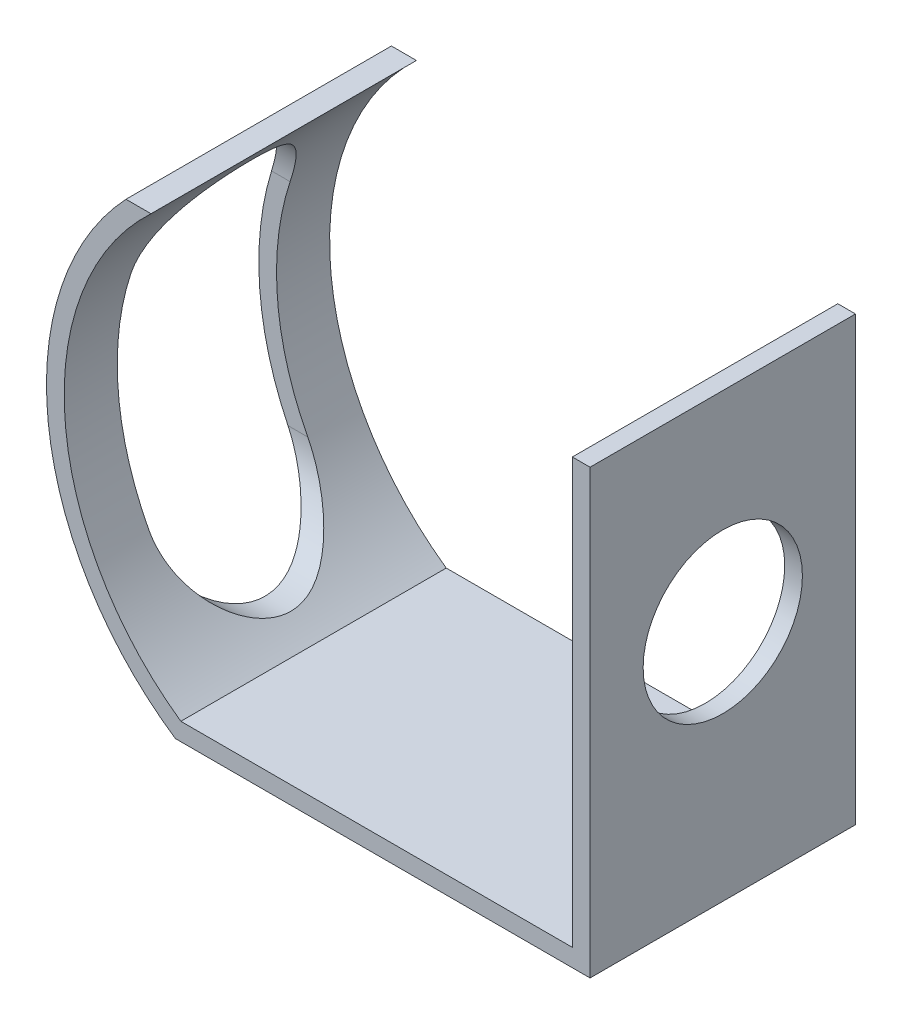
ISO-10303-21;
HEADER;
FILE_DESCRIPTION(('STEP AP214'),'2;1');
FILE_NAME('part.step','',(''),(''),'','','');
FILE_SCHEMA(('AUTOMOTIVE_DESIGN { 1 0 10303 214 1 1 1 1 }'));
ENDSEC;
DATA;
#1=APPLICATION_CONTEXT('core data for automotive mechanical design processes');
#2=APPLICATION_PROTOCOL_DEFINITION('international standard','automotive_design',2000,#1);
#3=PRODUCT_CONTEXT('',#1,'mechanical');
#4=PRODUCT('Part','Part','',(#3));
#5=PRODUCT_RELATED_PRODUCT_CATEGORY('part','',(#4));
#6=PRODUCT_DEFINITION_FORMATION('','',#4);
#7=PRODUCT_DEFINITION_CONTEXT('part definition',#1,'design');
#8=PRODUCT_DEFINITION('design','',#6,#7);
#9=PRODUCT_DEFINITION_SHAPE('','',#8);
#10=(LENGTH_UNIT() NAMED_UNIT(*) SI_UNIT(.MILLI.,.METRE.));
#11=(NAMED_UNIT(*) PLANE_ANGLE_UNIT() SI_UNIT($,.RADIAN.));
#12=(NAMED_UNIT(*) SI_UNIT($,.STERADIAN.) SOLID_ANGLE_UNIT());
#13=UNCERTAINTY_MEASURE_WITH_UNIT(LENGTH_MEASURE(1.E-05),#10,'distance_accuracy_value','');
#14=(GEOMETRIC_REPRESENTATION_CONTEXT(3) GLOBAL_UNCERTAINTY_ASSIGNED_CONTEXT((#13)) GLOBAL_UNIT_ASSIGNED_CONTEXT((#10,
#11,#12)) REPRESENTATION_CONTEXT('',''));
#15=CARTESIAN_POINT('',(0.,0.,0.));
#16=DIRECTION('',(0.,0.,1.));
#17=DIRECTION('',(1.,0.,0.));
#18=AXIS2_PLACEMENT_3D('',#15,#16,#17);
#19=CARTESIAN_POINT('',(-142.186281274897,136.841250999728,75.));
#20=DIRECTION('',(0.,0.,-1.));
#21=DIRECTION('',(-1.,0.,0.));
#22=AXIS2_PLACEMENT_3D('',#19,#20,#21);
#23=CYLINDRICAL_SURFACE('',#22,155.);
#24=CARTESIAN_POINT('',(-142.186281274897,136.841250999728,-75.));
#25=DIRECTION('',(0.,0.,-1.));
#26=DIRECTION('',(1.,0.,0.));
#27=AXIS2_PLACEMENT_3D('',#24,#25,#26);
#28=CIRCLE('',#27,155.);
#29=CARTESIAN_POINT('',(-231.272178277869,9.99999999999998,-75.));
#30=VERTEX_POINT('',#29);
#31=CARTESIAN_POINT('',(-248.111243038843,250.,-75.));
#32=VERTEX_POINT('',#31);
#33=EDGE_CURVE('E210',#30,#32,#28,.T.);
#34=ORIENTED_EDGE('',*,*,#33,.T.);
#35=DIRECTION('',(0.,0.,-1.));
#36=VECTOR('',#35,1.);
#37=CARTESIAN_POINT('',(-248.111243038843,250.,75.));
#38=LINE('',#37,#36);
#39=CARTESIAN_POINT('',(-248.111243038843,250.,75.));
#40=VERTEX_POINT('',#39);
#41=EDGE_CURVE('E216',#40,#32,#38,.T.);
#42=ORIENTED_EDGE('',*,*,#41,.F.);
#43=CARTESIAN_POINT('',(-142.186281274897,136.841250999728,75.));
#44=DIRECTION('',(0.,0.,-1.));
#45=DIRECTION('',(1.,0.,0.));
#46=AXIS2_PLACEMENT_3D('',#43,#44,#45);
#47=CIRCLE('',#46,155.);
#48=CARTESIAN_POINT('',(-231.272178277869,9.99999999999998,75.));
#49=VERTEX_POINT('',#48);
#50=EDGE_CURVE('E215',#49,#40,#47,.T.);
#51=ORIENTED_EDGE('',*,*,#50,.F.);
#52=DIRECTION('',(0.,0.,-1.));
#53=VECTOR('',#52,1.);
#54=CARTESIAN_POINT('',(-231.272178277869,9.99999999999998,75.));
#55=LINE('',#54,#53);
#56=EDGE_CURVE('E41',#49,#30,#55,.T.);
#57=ORIENTED_EDGE('',*,*,#56,.T.);
#58=EDGE_LOOP('',(#34,#42,#51,#57));
#59=FACE_BOUND('',#58,.T.);
#60=CARTESIAN_POINT('',(-289.514944116616,185.,45.0000000001244));
#61=CARTESIAN_POINT('',(-289.293101945858,185.678705591603,45.0000079403308));
#62=CARTESIAN_POINT('',(-289.066555096769,186.355845353168,44.9846455848749));
#63=CARTESIAN_POINT('',(-288.604582409206,187.705668042194,44.9236638699038));
#64=CARTESIAN_POINT('',(-288.369157211543,188.37835128721,44.8780466901642));
#65=CARTESIAN_POINT('',(-287.89005740975,189.717666803059,44.7570719366619));
#66=CARTESIAN_POINT('',(-287.6463873976,190.384302188197,44.6817306764639));
#67=CARTESIAN_POINT('',(-287.151271780437,191.710667952544,44.501853560459));
#68=CARTESIAN_POINT('',(-286.899826043564,192.370398214402,44.397317209322));
#69=CARTESIAN_POINT('',(-286.136491427043,194.332997106331,44.0415522785429));
#70=CARTESIAN_POINT('',(-285.613829947957,195.62422810659,43.7477132440592));
#71=CARTESIAN_POINT('',(-284.545235382897,198.166869874089,43.0508101147846));
#72=CARTESIAN_POINT('',(-283.999299165218,199.418275242823,42.6477312820312));
#73=CARTESIAN_POINT('',(-282.891080916228,201.871760963116,41.7378933388891));
#74=CARTESIAN_POINT('',(-282.328835850982,203.073939927315,41.231355047427));
#75=CARTESIAN_POINT('',(-281.193130001446,205.425514402962,40.1184575909758));
#76=CARTESIAN_POINT('',(-280.619669577728,206.574911607375,39.5121016304837));
#77=CARTESIAN_POINT('',(-279.46722118435,208.817185065787,38.2024887891619));
#78=CARTESIAN_POINT('',(-278.888225745381,209.909966416058,37.499076010746));
#79=CARTESIAN_POINT('',(-277.732840912875,212.031606168385,35.9997201530017));
#80=CARTESIAN_POINT('',(-277.15645161887,213.06046214787,35.2037735702108));
#81=CARTESIAN_POINT('',(-275.979329981358,215.109375621295,33.4713764957052));
#82=CARTESIAN_POINT('',(-275.379251998376,216.125083989223,32.5293221536942));
#83=CARTESIAN_POINT('',(-274.201165538176,218.071572069959,30.5483232605625));
#84=CARTESIAN_POINT('',(-273.623159860494,219.002341030158,29.5093664759851));
#85=CARTESIAN_POINT('',(-272.501349927294,220.770251341426,27.3394273467723));
#86=CARTESIAN_POINT('',(-271.957504744424,221.607505705336,26.2085589982745));
#87=CARTESIAN_POINT('',(-271.176726751848,222.787093252052,24.446579122792));
#88=CARTESIAN_POINT('',(-270.922319240572,223.167544263488,23.8483600475468));
#89=CARTESIAN_POINT('',(-270.426709736856,223.902084427436,22.6303698563795));
#90=CARTESIAN_POINT('',(-270.185511044487,224.256166999978,22.0105934172708));
#91=CARTESIAN_POINT('',(-269.600664546424,225.107663921628,20.4336270134518));
#92=CARTESIAN_POINT('',(-269.266460992354,225.587662911766,19.4634265100158));
#93=CARTESIAN_POINT('',(-268.638293490056,226.48045412955,17.4801001975549));
#94=CARTESIAN_POINT('',(-268.344320409709,226.893261613381,16.4669841987408));
#95=CARTESIAN_POINT('',(-267.9382986133,227.458489170642,14.9190619850179));
#96=CARTESIAN_POINT('',(-267.808807160793,227.63786547088,14.3985047922527));
#97=CARTESIAN_POINT('',(-267.562173467571,227.978124710596,13.3486072246738));
#98=CARTESIAN_POINT('',(-267.445029081439,228.139010863347,12.8192683943123));
#99=CARTESIAN_POINT('',(-267.113173412072,228.593160104738,11.2189743875455));
#100=CARTESIAN_POINT('',(-266.91800759968,228.8579583301,10.1356206123072));
#101=CARTESIAN_POINT('',(-266.584100296524,229.308878076356,7.93670666633617));
#102=CARTESIAN_POINT('',(-266.445731362611,229.494480419031,6.82098367982442));
#103=CARTESIAN_POINT('',(-266.231275023733,229.781402850693,4.57272802712599));
#104=CARTESIAN_POINT('',(-266.155187296559,229.882723375709,3.44019544793384));
#105=CARTESIAN_POINT('',(-266.067684925635,229.999198588639,1.16850329355244));
#106=CARTESIAN_POINT('',(-266.056253505791,230.014375627836,0.0293455141720952));
#107=CARTESIAN_POINT('',(-266.098388511853,229.958333025964,-2.2455805139968));
#108=CARTESIAN_POINT('',(-266.151950363079,229.887119465668,-3.38134899570724));
#109=CARTESIAN_POINT('',(-266.313698885447,229.67120305247,-5.52482875931312));
#110=CARTESIAN_POINT('',(-266.415793919583,229.534686859829,-6.53384405398937));
#111=CARTESIAN_POINT('',(-266.668554385072,229.194964879038,-8.53429791379006));
#112=CARTESIAN_POINT('',(-266.819215964018,228.991764380413,-9.52573786645125));
#113=CARTESIAN_POINT('',(-267.165706964251,228.521283356732,-11.4853657671239));
#114=CARTESIAN_POINT('',(-267.361545021578,228.253990579261,-12.4535492302484));
#115=CARTESIAN_POINT('',(-267.794277502043,227.658466468523,-14.3615533068984));
#116=CARTESIAN_POINT('',(-268.031174359507,227.330231521989,-15.3013722348441));
#117=CARTESIAN_POINT('',(-268.555198428008,226.59708860813,-17.197977641951));
#118=CARTESIAN_POINT('',(-268.844334068501,226.189019521375,-18.1529846964271));
#119=CARTESIAN_POINT('',(-269.457812942651,225.312958732178,-20.0232846447488));
#120=CARTESIAN_POINT('',(-269.782156922521,224.844965759657,-20.9385766962904));
#121=CARTESIAN_POINT('',(-270.460831602313,223.852750182446,-22.726850195733));
#122=CARTESIAN_POINT('',(-270.815170387942,223.328512405578,-23.5998201344692));
#123=CARTESIAN_POINT('',(-271.548673605876,222.227485802224,-25.3010094585916));
#124=CARTESIAN_POINT('',(-271.927839639849,221.650693584378,-26.1292259505177));
#125=CARTESIAN_POINT('',(-272.775368524811,220.340961580121,-27.8821935063602));
#126=CARTESIAN_POINT('',(-273.24761132499,219.59848500041,-28.7979577036086));
#127=CARTESIAN_POINT('',(-274.212638267057,218.050077288329,-30.5625680720482));
#128=CARTESIAN_POINT('',(-274.705424386643,217.244140039956,-31.4114077775968));
#129=CARTESIAN_POINT('',(-275.705347524994,215.572491422828,-33.0406737453068));
#130=CARTESIAN_POINT('',(-276.212496943935,214.706727414631,-33.8210383526163));
#131=CARTESIAN_POINT('',(-277.234644624074,212.920150663312,-35.3103070924538));
#132=CARTESIAN_POINT('',(-277.749643176405,211.99933587457,-36.0192085668671));
#133=CARTESIAN_POINT('',(-278.861744132538,209.960102562928,-37.4671774316871));
#134=CARTESIAN_POINT('',(-279.459230354307,208.833143467472,-38.1939639869738));
#135=CARTESIAN_POINT('',(-280.649330851082,206.516782612009,-39.5452423678248));
#136=CARTESIAN_POINT('',(-281.241944347459,205.327371088494,-40.169718135365));
#137=CARTESIAN_POINT('',(-282.414294327719,202.893706240328,-41.3112566359588));
#138=CARTESIAN_POINT('',(-282.994043172822,201.649509323032,-41.828426855324));
#139=CARTESIAN_POINT('',(-284.13439678303,199.112156165089,-42.7512393585448));
#140=CARTESIAN_POINT('',(-284.695006397227,197.819012503258,-43.1569100782017));
#141=CARTESIAN_POINT('',(-285.629192955804,195.579138443663,-43.7492858428923));
#142=CARTESIAN_POINT('',(-286.009169406793,194.642717410018,-43.9652839556337));
#143=CARTESIAN_POINT('',(-286.754462966622,192.752540453573,-44.3376322137473));
#144=CARTESIAN_POINT('',(-287.119783463457,191.798788612046,-44.4939962165757));
#145=CARTESIAN_POINT('',(-287.834086086068,189.876787342597,-44.7454621309322));
#146=CARTESIAN_POINT('',(-288.183063567975,188.908533895961,-44.8405467266854));
#147=CARTESIAN_POINT('',(-288.692928081494,187.44825355637,-44.9360018706189));
#148=CARTESIAN_POINT('',(-288.860656892482,186.960051585333,-44.9599583817962));
#149=CARTESIAN_POINT('',(-289.191387969822,185.981513822266,-44.9919576233472));
#150=CARTESIAN_POINT('',(-289.354390090597,185.491177965049,-44.9999998640934));
#151=CARTESIAN_POINT('',(-289.514944116616,185.,-45.0000000001244));
#152=B_SPLINE_CURVE_WITH_KNOTS('',3,(#60,#61,#62,#63,#64,#65,#66,#67,#68,#69,#70,#71,#72,#73,
#74,#75,#76,#77,#78,#79,#80,#81,#82,#83,#84,#85,#86,#87,#88,#89,#90,#91,#92,#93,#94,#95,#96,#97,
#98,#99,#100,#101,#102,#103,#104,#105,#106,#107,#108,#109,#110,#111,#112,#113,#114,#115,#116,
#117,#118,#119,#120,#121,#122,#123,#124,#125,#126,#127,#128,#129,#130,#131,#132,#133,#134,#135,
#136,#137,#138,#139,#140,#141,#142,#143,#144,#145,#146,#147,#148,#149,#150,#151),.UNSPECIFIED.,
.F.,.F.,(4,2,2,2,2,2,2,2,2,2,2,2,2,2,2,2,2,2,2,2,2,2,2,2,2,2,2,2,2,2,2,2,2,2,2,2,2,2,2,2,2,2,2,
2,2,4),(0.,2.14189999414514,4.28364568713333,6.42421755037735,8.56482573322492,12.8302478204851,
17.0962456590152,21.3532317577423,25.6100812189308,29.8738496187217,34.1377795034988,
38.6613021702715,43.1853966845168,47.703963260202,49.9628615915063,52.2223217315423,
55.6174955575344,59.0118974128635,60.708305862447,62.4044190578294,65.7962481649792,
69.2099833756892,72.6237009254846,76.0365326920378,79.4491242535953,82.5155769244655,
85.5817864173159,88.6485825404105,91.7155605523232,94.9465188232728,98.1775455852207,
101.409446126625,104.641555371816,108.44781803335,112.2544479723,116.064470957484,
119.874635606544,124.273870217335,128.673794642772,133.069290224604,137.463663777542,
140.562061718812,143.659739231585,146.758291674427,148.308356507514,149.858469030033),.UNSPECIFIED.);
#153=CARTESIAN_POINT('',(-289.514944116616,185.,45.0000000001245));
#154=VERTEX_POINT('',#153);
#155=CARTESIAN_POINT('',(-289.514944116616,185.,-45.0000000001244));
#156=VERTEX_POINT('',#155);
#157=EDGE_CURVE('E133',#154,#156,#152,.T.);
#158=ORIENTED_EDGE('',*,*,#157,.T.);
#159=CARTESIAN_POINT('',(-142.186281274897,136.841250999728,-45.0000000001245));
#160=DIRECTION('',(0.,0.,1.));
#161=DIRECTION('',(0.,-1.,0.));
#162=AXIS2_PLACEMENT_3D('',#159,#160,#161);
#163=CIRCLE('',#162,155.);
#164=CARTESIAN_POINT('',(-279.531957052455,65.,-45.0000000001245));
#165=VERTEX_POINT('',#164);
#166=EDGE_CURVE('E142',#156,#165,#163,.T.);
#167=ORIENTED_EDGE('',*,*,#166,.T.);
#168=CARTESIAN_POINT('',(-279.531957052455,65.,-45.0000000001245));
#169=CARTESIAN_POINT('',(-279.084420199284,64.1443354434482,-45.0000058951737));
#170=CARTESIAN_POINT('',(-278.628870139108,63.2929502400309,-44.9755961967856));
#171=CARTESIAN_POINT('',(-277.703202193171,61.60102720247,-44.8794455861294));
#172=CARTESIAN_POINT('',(-277.233086975691,60.7604874209845,-44.8077132948899));
#173=CARTESIAN_POINT('',(-276.280060684979,59.09306591923,-44.6185111627578));
#174=CARTESIAN_POINT('',(-275.797162896353,58.2661713651923,-44.5010871933924));
#175=CARTESIAN_POINT('',(-274.819523087473,56.6269520951698,-44.2219779095891));
#176=CARTESIAN_POINT('',(-274.324780539247,55.8146280314885,-44.0602906187787));
#177=CARTESIAN_POINT('',(-273.326845190299,54.2092814534464,-43.6947993625822));
#178=CARTESIAN_POINT('',(-272.823692091191,53.4161968448177,-43.4911593584934));
#179=CARTESIAN_POINT('',(-271.808499788501,51.8474067462564,-43.0427108471363));
#180=CARTESIAN_POINT('',(-271.29645937066,51.0717036648372,-42.7978966739599));
#181=CARTESIAN_POINT('',(-270.265040013405,49.5389902026961,-42.2683638827191));
#182=CARTESIAN_POINT('',(-269.745660884895,48.78198030503,-41.983644234713));
#183=CARTESIAN_POINT('',(-268.701112686862,47.2877538717121,-41.3754408203863));
#184=CARTESIAN_POINT('',(-268.175943092955,46.550539149826,-41.0519535166504));
#185=CARTESIAN_POINT('',(-266.741470198109,44.5732200998821,-40.1205355572146));
#186=CARTESIAN_POINT('',(-265.827954252671,43.3533810888701,-39.4755579121501));
#187=CARTESIAN_POINT('',(-263.99729735269,40.9802961578975,-38.0782103145061));
#188=CARTESIAN_POINT('',(-263.08015689273,39.8270414661041,-37.3258545534925));
#189=CARTESIAN_POINT('',(-261.250613322976,37.5901845035564,-35.7155848980335));
#190=CARTESIAN_POINT('',(-260.338215677449,36.5066509480333,-34.8575692226607));
#191=CARTESIAN_POINT('',(-258.529999904841,34.4154291019487,-33.0379341226888));
#192=CARTESIAN_POINT('',(-257.634179899351,33.4077321781825,-32.076326521339));
#193=CARTESIAN_POINT('',(-256.015930024833,31.6318893380191,-30.2149378344355));
#194=CARTESIAN_POINT('',(-255.289065760892,30.8514904850081,-29.3306855287844));
#195=CARTESIAN_POINT('',(-253.865093962242,29.3521283144622,-27.4888988712318));
#196=CARTESIAN_POINT('',(-253.167987072258,28.6331663276824,-26.5313629328191));
#197=CARTESIAN_POINT('',(-251.815538939892,27.2631956061461,-24.5435901327009));
#198=CARTESIAN_POINT('',(-251.160131277917,26.6120776959469,-23.5134746895734));
#199=CARTESIAN_POINT('',(-250.217787546218,25.6909601324073,-21.9129652349022));
#200=CARTESIAN_POINT('',(-249.910498270123,25.3932096922909,-21.3703003419326));
#201=CARTESIAN_POINT('',(-249.311263820872,24.8170983848331,-20.2662828864077));
#202=CARTESIAN_POINT('',(-249.019322236559,24.538742047623,-19.7049260026768));
#203=CARTESIAN_POINT('',(-248.33002870169,23.8863157879552,-18.3161677245952));
#204=CARTESIAN_POINT('',(-247.941892788735,23.5231117942594,-17.4790008652122));
#205=CARTESIAN_POINT('',(-247.208409215771,22.8429927537447,-15.7681273067051));
#206=CARTESIAN_POINT('',(-246.863049567978,22.5260647338958,-14.8944309369744));
#207=CARTESIAN_POINT('',(-246.22244073476,21.942751398693,-13.1130071283865));
#208=CARTESIAN_POINT('',(-245.927158274762,21.6763325077684,-12.2053027801699));
#209=CARTESIAN_POINT('',(-245.393870471974,21.1981706294851,-10.3590008089681));
#210=CARTESIAN_POINT('',(-245.15586556651,20.9864280595924,-9.42040295016583));
#211=CARTESIAN_POINT('',(-244.741943476251,20.6198513968107,-7.50739295400432));
#212=CARTESIAN_POINT('',(-244.566734634198,20.4656657897446,-6.53270120303685));
#213=CARTESIAN_POINT('',(-244.288163555724,20.2211830064201,-4.56509236626437));
#214=CARTESIAN_POINT('',(-244.184799536566,20.1308842448909,-3.57217573331392));
#215=CARTESIAN_POINT('',(-244.05389522474,20.0166093790711,-1.57827071749368));
#216=CARTESIAN_POINT('',(-244.026297270951,19.9925828388038,-0.577289054666627));
#217=CARTESIAN_POINT('',(-244.047875541524,20.0113921703207,1.4231530773599));
#218=CARTESIAN_POINT('',(-244.097043741153,20.0542210533878,2.42261369462959));
#219=CARTESIAN_POINT('',(-244.257145695022,20.1941437935747,4.26065691240635));
#220=CARTESIAN_POINT('',(-244.357704935963,20.2821312763597,5.10087718299459));
#221=CARTESIAN_POINT('',(-244.610062741877,20.5038227911029,6.76731595801823));
#222=CARTESIAN_POINT('',(-244.761853935076,20.6375202458823,7.59353645893015));
#223=CARTESIAN_POINT('',(-245.113019163988,20.9484493388311,9.22785546129337));
#224=CARTESIAN_POINT('',(-245.312418767243,21.1257043705881,10.0359439691908));
#225=CARTESIAN_POINT('',(-245.754348464049,21.5210736572734,11.6300342279669));
#226=CARTESIAN_POINT('',(-245.996885926337,21.7391948932374,12.416032178769));
#227=CARTESIAN_POINT('',(-246.621631480951,22.3052423273215,14.2624015324235));
#228=CARTESIAN_POINT('',(-247.021593783885,22.6707565721029,15.3114201906909));
#229=CARTESIAN_POINT('',(-247.883136237455,23.4678893036809,17.357728638495));
#230=CARTESIAN_POINT('',(-248.344737513764,23.8995304618158,18.3550005292889));
#231=CARTESIAN_POINT('',(-249.319068527764,24.8233185986184,20.2976156740581));
#232=CARTESIAN_POINT('',(-249.83189316856,25.3155782950937,21.2428573116825));
#233=CARTESIAN_POINT('',(-250.897916445062,26.3544428771366,23.0788576473289));
#234=CARTESIAN_POINT('',(-251.451116166792,26.9010492246844,23.9696148786233));
#235=CARTESIAN_POINT('',(-252.812760353803,28.2685033339632,26.0360804079043));
#236=CARTESIAN_POINT('',(-253.63619053293,29.1128052374746,27.1864655216867));
#237=CARTESIAN_POINT('',(-255.325851918468,30.8887066877876,29.3839478405287));
#238=CARTESIAN_POINT('',(-256.192099323832,31.8203393956338,30.431005498013));
#239=CARTESIAN_POINT('',(-257.952998398196,33.7646323866488,32.4236215491398));
#240=CARTESIAN_POINT('',(-258.847679197639,34.7773774981016,33.3690711956713));
#241=CARTESIAN_POINT('',(-260.651950325094,36.8772492545484,35.1569634245204));
#242=CARTESIAN_POINT('',(-261.561538749732,37.9643664592688,35.999419042485));
#243=CARTESIAN_POINT('',(-263.405418082741,40.2332551410492,37.5975544721309));
#244=CARTESIAN_POINT('',(-264.339809860258,41.4165899245654,38.350898662533));
#245=CARTESIAN_POINT('',(-266.203514644565,43.8515921347005,39.7456087097789));
#246=CARTESIAN_POINT('',(-267.132827078035,45.1032671067207,40.3869621688376));
#247=CARTESIAN_POINT('',(-268.975217127566,47.6669708348901,41.5517028608462));
#248=CARTESIAN_POINT('',(-269.888326408812,48.9788583251186,42.0753507589439));
#249=CARTESIAN_POINT('',(-271.691932010089,51.6597151852208,43.0005367488677));
#250=CARTESIAN_POINT('',(-272.582435361152,53.028666447935,43.4021132453226));
#251=CARTESIAN_POINT('',(-273.990787856886,55.2717772918813,43.9445698111309));
#252=CARTESIAN_POINT('',(-274.518294920689,56.1302759386798,44.126003767705));
#253=CARTESIAN_POINT('',(-275.56019634056,57.8639063632932,44.4393043386264));
#254=CARTESIAN_POINT('',(-276.074593943476,58.7390339269914,44.5711833397849));
#255=CARTESIAN_POINT('',(-277.089095666251,60.5047099406272,44.783743522353));
#256=CARTESIAN_POINT('',(-277.58918715118,61.3952709705137,44.8643807045658));
#257=CARTESIAN_POINT('',(-278.573182528624,63.1889388088006,44.9725227184758));
#258=CARTESIAN_POINT('',(-279.057079712684,64.0920506023512,45.0000057924938));
#259=CARTESIAN_POINT('',(-279.531957052455,64.9999999999999,45.0000000001245));
#260=B_SPLINE_CURVE_WITH_KNOTS('',3,(#168,#169,#170,#171,#172,#173,#174,#175,#176,#177,#178,
#179,#180,#181,#182,#183,#184,#185,#186,#187,#188,#189,#190,#191,#192,#193,#194,#195,#196,#197,
#198,#199,#200,#201,#202,#203,#204,#205,#206,#207,#208,#209,#210,#211,#212,#213,#214,#215,#216,
#217,#218,#219,#220,#221,#222,#223,#224,#225,#226,#227,#228,#229,#230,#231,#232,#233,#234,#235,
#236,#237,#238,#239,#240,#241,#242,#243,#244,#245,#246,#247,#248,#249,#250,#251,#252,#253,#254,
#255,#256,#257,#258,#259),.UNSPECIFIED.,.F.,.F.,(4,2,2,2,2,2,2,2,2,2,2,2,2,2,2,2,2,2,2,2,2,2,2,
2,2,2,2,2,2,2,2,2,2,2,2,2,2,2,2,2,2,2,2,2,2,4),(0.,2.89644072113623,5.79235392667661,
8.68536729022324,11.5785098488858,14.4605528098494,17.3429926888778,20.2255069760506,
23.1082844832903,28.0675577971103,33.0261762773849,37.9896092585601,42.9524763475861,
47.1052621714784,51.2581379241292,55.4042241159758,57.4768240919772,59.5499065800659,
62.5223591844945,65.4939768835306,68.4636122417285,71.4332702730788,74.4354436249182,
77.4375424790273,80.4373559771197,83.4368559113626,85.9862977479329,88.5353729012159,
91.085820096982,93.6367033749447,97.1733800870607,100.711272058962,104.255844858195,
107.800513035857,112.735947895205,117.673264476734,122.615813729249,127.557736768988,
132.609131746472,137.661085577881,142.701738884665,147.740804716836,150.811016033012,
153.880459404471,156.952534829282,160.025867487055),.UNSPECIFIED.);
#261=CARTESIAN_POINT('',(-279.531957052455,65.,45.0000000001245));
#262=VERTEX_POINT('',#261);
#263=EDGE_CURVE('E139',#165,#262,#260,.T.);
#264=ORIENTED_EDGE('',*,*,#263,.T.);
#265=CARTESIAN_POINT('',(-142.186281274897,136.841250999728,45.0000000001245));
#266=DIRECTION('',(0.,0.,-1.));
#267=DIRECTION('',(-1.,0.,0.));
#268=AXIS2_PLACEMENT_3D('',#265,#266,#267);
#269=CIRCLE('',#268,155.);
#270=EDGE_CURVE('E124',#262,#154,#269,.T.);
#271=ORIENTED_EDGE('',*,*,#270,.T.);
#272=EDGE_LOOP('',(#158,#167,#264,#271));
#273=FACE_BOUND('',#272,.T.);
#274=ADVANCED_FACE('F33',(#59,#273),#23,.F.);
#275=CARTESIAN_POINT('',(-142.186281274897,136.841250999728,75.));
#276=DIRECTION('',(0.,0.,-1.));
#277=DIRECTION('',(-1.,0.,0.));
#278=AXIS2_PLACEMENT_3D('',#275,#276,#277);
#279=CYLINDRICAL_SURFACE('',#278,165.);
#280=CARTESIAN_POINT('',(-142.186281274897,136.841250999728,-75.));
#281=DIRECTION('',(0.,0.,1.));
#282=DIRECTION('',(1.,0.,0.));
#283=AXIS2_PLACEMENT_3D('',#280,#281,#282);
#284=CIRCLE('',#283,165.);
#285=CARTESIAN_POINT('',(-262.269991763428,250.,-75.));
#286=VERTEX_POINT('',#285);
#287=CARTESIAN_POINT('',(-234.378862455974,0.,-75.));
#288=VERTEX_POINT('',#287);
#289=EDGE_CURVE('E222',#286,#288,#284,.T.);
#290=ORIENTED_EDGE('',*,*,#289,.T.);
#291=DIRECTION('',(0.,0.,-1.));
#292=VECTOR('',#291,1.);
#293=CARTESIAN_POINT('',(-234.378862455974,0.,75.));
#294=LINE('',#293,#292);
#295=CARTESIAN_POINT('',(-234.378862455974,0.,75.));
#296=VERTEX_POINT('',#295);
#297=EDGE_CURVE('E244',#296,#288,#294,.T.);
#298=ORIENTED_EDGE('',*,*,#297,.F.);
#299=CARTESIAN_POINT('',(-142.186281274897,136.841250999728,75.));
#300=DIRECTION('',(0.,0.,1.));
#301=DIRECTION('',(1.,0.,0.));
#302=AXIS2_PLACEMENT_3D('',#299,#300,#301);
#303=CIRCLE('',#302,165.);
#304=CARTESIAN_POINT('',(-262.269991763428,250.,75.));
#305=VERTEX_POINT('',#304);
#306=EDGE_CURVE('E255',#305,#296,#303,.T.);
#307=ORIENTED_EDGE('',*,*,#306,.F.);
#308=DIRECTION('',(0.,0.,-1.));
#309=VECTOR('',#308,1.);
#310=CARTESIAN_POINT('',(-262.269991763428,250.,75.));
#311=LINE('',#310,#309);
#312=EDGE_CURVE('E247',#305,#286,#311,.T.);
#313=ORIENTED_EDGE('',*,*,#312,.T.);
#314=EDGE_LOOP('',(#290,#298,#307,#313));
#315=FACE_BOUND('',#314,.T.);
#316=CARTESIAN_POINT('',(-300.001790318618,185.,-45.0000000001244));
#317=CARTESIAN_POINT('',(-299.796324241225,185.673347660446,-45.000007927535));
#318=CARTESIAN_POINT('',(-299.586534460935,186.345351320393,-44.9848870118551));
#319=CARTESIAN_POINT('',(-299.158791770701,187.685371665605,-44.9248080842916));
#320=CARTESIAN_POINT('',(-298.940839373144,188.353388598086,-44.8798519422864));
#321=CARTESIAN_POINT('',(-298.497336509975,189.683901255965,-44.7605517378466));
#322=CARTESIAN_POINT('',(-298.271789748318,190.346399481797,-44.6862218170985));
#323=CARTESIAN_POINT('',(-297.813549338902,191.664976523334,-44.5086594626723));
#324=CARTESIAN_POINT('',(-297.580855587093,192.321055245396,-44.4054266080302));
#325=CARTESIAN_POINT('',(-296.874301503315,194.274057175568,-44.0538032920683));
#326=CARTESIAN_POINT('',(-296.390531439829,195.560049896967,-43.7630968389056));
#327=CARTESIAN_POINT('',(-295.401673620497,198.093962883325,-43.0728846418141));
#328=CARTESIAN_POINT('',(-294.896583403158,199.341878723352,-42.6733663059491));
#329=CARTESIAN_POINT('',(-293.871399510341,201.79033127099,-41.7706122059955));
#330=CARTESIAN_POINT('',(-293.35133406538,202.990948165381,-41.2675618493393));
#331=CARTESIAN_POINT('',(-292.301233192889,205.340574487218,-40.1615138617931));
#332=CARTESIAN_POINT('',(-291.771198027492,206.489585268854,-39.5585188554866));
#333=CARTESIAN_POINT('',(-290.706733708193,208.73156468732,-38.2556675104417));
#334=CARTESIAN_POINT('',(-290.17229962653,209.824456332464,-37.555682730847));
#335=CARTESIAN_POINT('',(-289.106553167599,211.946802749806,-36.0631785282506));
#336=CARTESIAN_POINT('',(-288.575240890383,212.97625549875,-35.270656156283));
#337=CARTESIAN_POINT('',(-287.496517414676,215.016267045791,-33.5542788610928));
#338=CARTESIAN_POINT('',(-286.949651818911,216.023234506116,-32.6258078468758));
#339=CARTESIAN_POINT('',(-285.876733125416,217.953972165564,-30.6744056316022));
#340=CARTESIAN_POINT('',(-285.350682152365,218.877733883582,-29.6514648227777));
#341=CARTESIAN_POINT('',(-284.585386979946,220.194431600651,-28.0504752469398));
#342=CARTESIAN_POINT('',(-284.334337720711,220.621699458882,-27.5059224122186));
#343=CARTESIAN_POINT('',(-283.841386457655,221.452504977634,-26.3949964566155));
#344=CARTESIAN_POINT('',(-283.599483848345,221.856044209926,-25.8286247851245));
#345=CARTESIAN_POINT('',(-283.126318652567,222.638190083057,-24.6749301115465));
#346=CARTESIAN_POINT('',(-282.895052403772,223.016805325426,-24.0876144464778));
#347=CARTESIAN_POINT('',(-282.444475849208,223.748232429596,-22.8924768537102));
#348=CARTESIAN_POINT('',(-282.225168600872,224.101037700635,-22.2846497457674));
#349=CARTESIAN_POINT('',(-281.679681710693,224.971747542879,-20.6996919797879));
#350=CARTESIAN_POINT('',(-281.363284985494,225.470048025612,-19.7082933208096));
#351=CARTESIAN_POINT('',(-280.769525937638,226.395630574843,-17.6816875236404));
#352=CARTESIAN_POINT('',(-280.492155797221,226.822926867932,-16.6464892135426));
#353=CARTESIAN_POINT('',(-280.109784997833,227.407034407304,-15.0651677176233));
#354=CARTESIAN_POINT('',(-279.987961862693,227.592234638685,-14.5334091484546));
#355=CARTESIAN_POINT('',(-279.756187026654,227.943200900026,-13.4610415032524));
#356=CARTESIAN_POINT('',(-279.646233130718,228.108970523875,-12.9204340850512));
#357=CARTESIAN_POINT('',(-279.438827176356,228.420581153932,-11.8310645863661));
#358=CARTESIAN_POINT('',(-279.341376410264,228.566420100191,-11.2823016694535));
#359=CARTESIAN_POINT('',(-279.159593645943,228.837654388695,-10.1776089269033));
#360=CARTESIAN_POINT('',(-279.075262289168,228.963048731346,-9.62167875227093));
#361=CARTESIAN_POINT('',(-278.841959299901,229.309106563714,-7.93845324206562));
#362=CARTESIAN_POINT('',(-278.713779711583,229.497998930093,-6.80145643589364));
#363=CARTESIAN_POINT('',(-278.516400783035,229.788167714595,-4.51138785460208));
#364=CARTESIAN_POINT('',(-278.447201303929,229.889444339021,-3.35831611733957));
#365=CARTESIAN_POINT('',(-278.369775344078,230.00272772792,-1.04593197805265));
#366=CARTESIAN_POINT('',(-278.361536367159,230.014752787895,0.113379096219922));
#367=CARTESIAN_POINT('',(-278.406261556211,229.949352560753,2.42822450639414));
#368=CARTESIAN_POINT('',(-278.459221922367,229.871932827188,3.58375907230892));
#369=CARTESIAN_POINT('',(-278.617299320956,229.639929553247,5.77771563415046));
#370=CARTESIAN_POINT('',(-278.717296008616,229.492913817687,6.8173219573526));
#371=CARTESIAN_POINT('',(-278.964282970655,229.127906381133,8.87822605299552));
#372=CARTESIAN_POINT('',(-279.111269944908,228.909919664408,9.89952510583734));
#373=CARTESIAN_POINT('',(-279.449013788169,228.405622805073,11.9178084473337));
#374=CARTESIAN_POINT('',(-279.639776985977,228.119302783165,12.9147891971726));
#375=CARTESIAN_POINT('',(-280.06116783753,227.481537804122,14.8790246975191));
#376=CARTESIAN_POINT('',(-280.291797657761,227.13008930761,15.8462778291611));
#377=CARTESIAN_POINT('',(-280.80065347679,226.347028117178,17.792588434849));
#378=CARTESIAN_POINT('',(-281.080642141911,225.912360088185,18.7699537351115));
#379=CARTESIAN_POINT('',(-281.674577143066,224.979330242642,20.682985768469));
#380=CARTESIAN_POINT('',(-281.988524123705,224.480967216987,21.6186517095414));
#381=CARTESIAN_POINT('',(-282.645341069727,223.424387017122,23.4452560417168));
#382=CARTESIAN_POINT('',(-282.988219046713,222.866153251763,24.3361819336836));
#383=CARTESIAN_POINT('',(-283.69785791021,221.693730466579,26.0704023581926));
#384=CARTESIAN_POINT('',(-284.064620269923,221.079537994255,26.9136939466211));
#385=CARTESIAN_POINT('',(-284.8754421347,219.699795498841,28.6768779529882));
#386=CARTESIAN_POINT('',(-285.322691629203,218.925519220999,29.5884873130781));
#387=CARTESIAN_POINT('',(-286.235893078158,217.31216933777,31.3423637763356));
#388=CARTESIAN_POINT('',(-286.701846656981,216.473090098647,32.1846248374327));
#389=CARTESIAN_POINT('',(-287.64650812822,214.734139857575,33.7977591898743));
#390=CARTESIAN_POINT('',(-288.125226111767,213.834219838622,34.5685737051609));
#391=CARTESIAN_POINT('',(-289.089181412973,211.978666475356,36.035404379335));
#392=CARTESIAN_POINT('',(-289.574418920086,211.023031509292,36.7314183592503));
#393=CARTESIAN_POINT('',(-290.609106614671,208.932825044488,38.1313620637405));
#394=CARTESIAN_POINT('',(-291.158711581222,207.79113345389,38.8245795629915));
#395=CARTESIAN_POINT('',(-292.25207329345,205.448316021553,40.1079866510932));
#396=CARTESIAN_POINT('',(-292.795829113645,204.24718093796,40.6981601543982));
#397=CARTESIAN_POINT('',(-293.870103058608,201.793617681178,41.7703843747304));
#398=CARTESIAN_POINT('',(-294.400634418279,200.541244400069,42.2525473941252));
#399=CARTESIAN_POINT('',(-295.442723575357,197.991540465659,43.1048201169623));
#400=CARTESIAN_POINT('',(-295.954287126709,196.694223680973,43.4749640498633));
#401=CARTESIAN_POINT('',(-296.772805727235,194.537158921901,43.9862578542779));
#402=CARTESIAN_POINT('',(-297.087065218185,193.688188178287,44.1618620783597));
#403=CARTESIAN_POINT('',(-297.704139982396,191.977644254809,44.4642158803288));
#404=CARTESIAN_POINT('',(-298.006957976345,191.116074139418,44.5909771394281));
#405=CARTESIAN_POINT('',(-298.599842395086,189.383003036627,44.7945327525485));
#406=CARTESIAN_POINT('',(-298.889912783833,188.511505243983,44.8713427432503));
#407=CARTESIAN_POINT('',(-299.456399012854,186.760783574428,44.9740966020275));
#408=CARTESIAN_POINT('',(-299.732810162513,185.881557163909,45.0000231133108));
#409=CARTESIAN_POINT('',(-300.001790318618,185.,45.0000000001244));
#410=B_SPLINE_CURVE_WITH_KNOTS('',3,(#316,#317,#318,#319,#320,#321,#322,#323,#324,#325,#326,
#327,#328,#329,#330,#331,#332,#333,#334,#335,#336,#337,#338,#339,#340,#341,#342,#343,#344,#345,
#346,#347,#348,#349,#350,#351,#352,#353,#354,#355,#356,#357,#358,#359,#360,#361,#362,#363,#364,
#365,#366,#367,#368,#369,#370,#371,#372,#373,#374,#375,#376,#377,#378,#379,#380,#381,#382,#383,
#384,#385,#386,#387,#388,#389,#390,#391,#392,#393,#394,#395,#396,#397,#398,#399,#400,#401,#402,
#403,#404,#405,#406,#407,#408,#409),.UNSPECIFIED.,.F.,.F.,(4,2,2,2,2,2,2,2,2,2,2,2,2,2,2,2,2,2,
2,2,2,2,2,2,2,2,2,2,2,2,2,2,2,2,2,2,2,2,2,2,2,2,2,2,2,2,4),(0.,2.11178002405801,
4.22342770794739,6.33405999812625,8.44472303073642,12.6524318955792,16.8606278922369,
21.061352329082,25.2619664708139,29.4681975017847,33.6745626125243,38.0937538781675,
42.513395080431,44.7216359055698,46.9297302928494,49.137058604795,51.3449486207007,
54.8027588631569,58.2598754518382,59.9877844818324,61.7153734114913,63.4431407626308,
65.1709925640067,68.6448293010206,72.1186578583971,75.5917743027936,79.0646751159323,
82.2251687850547,85.385440541582,88.5461694719443,91.7070702210184,95.0208679668693,
98.334728626991,101.649509995871,104.964496016399,108.791436588141,112.618710235542,
116.449104982221,120.279611279747,124.607610254591,128.93628424308,133.260436446239,
137.58326598922,140.348400290748,143.112872875741,145.876479656698,148.641028963948),.UNSPECIFIED.);
#411=CARTESIAN_POINT('',(-300.001790318618,185.,-45.0000000001244));
#412=VERTEX_POINT('',#411);
#413=CARTESIAN_POINT('',(-300.001790318618,185.,45.0000000001245));
#414=VERTEX_POINT('',#413);
#415=EDGE_CURVE('E130',#412,#414,#410,.T.);
#416=ORIENTED_EDGE('',*,*,#415,.T.);
#417=CARTESIAN_POINT('',(-142.186281274897,136.841250999728,45.0000000001245));
#418=DIRECTION('',(0.,0.,-1.));
#419=DIRECTION('',(-1.,0.,0.));
#420=AXIS2_PLACEMENT_3D('',#417,#418,#419);
#421=CIRCLE('',#420,165.);
#422=CARTESIAN_POINT('',(-290.725281725264,65.,45.0000000001245));
#423=VERTEX_POINT('',#422);
#424=EDGE_CURVE('E119',#414,#423,#421,.F.);
#425=ORIENTED_EDGE('',*,*,#424,.T.);
#426=CARTESIAN_POINT('',(-290.725281725264,65.,45.0000000001245));
#427=CARTESIAN_POINT('',(-290.374888070719,64.2754923129435,45.0000039819248));
#428=CARTESIAN_POINT('',(-290.01918576738,63.5535981774404,44.9825033859898));
#429=CARTESIAN_POINT('',(-289.297977820586,62.1164640789348,44.9132787131404));
#430=CARTESIAN_POINT('',(-288.932473180408,61.4012234449571,44.8615581259422));
#431=CARTESIAN_POINT('',(-288.192651267016,59.9791528229749,44.7247247916245));
#432=CARTESIAN_POINT('',(-287.818340077365,59.2723175088767,44.6396344945055));
#433=CARTESIAN_POINT('',(-287.061514411444,57.8678153687393,44.436870924413));
#434=CARTESIAN_POINT('',(-286.678999723426,57.1701487801147,44.3191968094504));
#435=CARTESIAN_POINT('',(-285.522362960992,55.0961173006436,43.919152879015));
#436=CARTESIAN_POINT('',(-284.737100935919,53.7347907032443,43.5893755090156));
#437=CARTESIAN_POINT('',(-283.144160087322,51.0607138969013,42.809313209727));
#438=CARTESIAN_POINT('',(-282.33647737862,49.7479722001351,42.3590072762816));
#439=CARTESIAN_POINT('',(-280.708325025431,47.1810779119375,41.3447100181663));
#440=CARTESIAN_POINT('',(-279.887896867148,45.9267734905186,40.7810361760114));
#441=CARTESIAN_POINT('',(-278.239917970127,43.4785952421442,39.5437788708234));
#442=CARTESIAN_POINT('',(-277.412367318556,42.2847206768592,38.8701967510697));
#443=CARTESIAN_POINT('',(-275.757610718158,39.9612397992025,37.4157895907094));
#444=CARTESIAN_POINT('',(-274.930406343023,38.8317114128338,36.6348382687951));
#445=CARTESIAN_POINT('',(-273.286821549604,36.6438467873621,34.9688295598306));
#446=CARTESIAN_POINT('',(-272.470440195648,35.5855043614339,34.0837812383532));
#447=CARTESIAN_POINT('',(-270.940691213776,33.6488698894491,32.3056626935237));
#448=CARTESIAN_POINT('',(-270.225244595592,32.7631875390265,31.4224234819509));
#449=CARTESIAN_POINT('',(-268.820936151404,31.0590080792156,29.5734633241952));
#450=CARTESIAN_POINT('',(-268.132075323131,30.2405134899995,28.6077392868264));
#451=CARTESIAN_POINT('',(-266.792718847813,28.6779802781421,26.5956978779428));
#452=CARTESIAN_POINT('',(-266.14216897105,27.9338353190334,25.5494995084976));
#453=CARTESIAN_POINT('',(-264.89110420963,26.5261910274675,23.3760805194891));
#454=CARTESIAN_POINT('',(-264.290573588063,25.862666300143,22.2488855923034));
#455=CARTESIAN_POINT('',(-263.302524259727,24.7866125334627,20.2197091747316));
#456=CARTESIAN_POINT('',(-262.900289157572,24.3537460372629,19.3356275841708));
#457=CARTESIAN_POINT('',(-262.1379771213,23.541203053225,17.5257426467121));
#458=CARTESIAN_POINT('',(-261.777894756056,23.1615197118141,16.5999446960518));
#459=CARTESIAN_POINT('',(-261.107310667041,22.460202692797,14.7098983311025));
#460=CARTESIAN_POINT('',(-260.796776299896,22.1385307775604,13.7456757596109));
#461=CARTESIAN_POINT('',(-260.232351273175,21.5577319999908,11.7820531143845));
#462=CARTESIAN_POINT('',(-259.978461293179,21.2986058880379,10.7826526187748));
#463=CARTESIAN_POINT('',(-259.644327239309,20.9592731997237,9.25689195626484));
#464=CARTESIAN_POINT('',(-259.540317367409,20.8539733860351,8.74111887909866));
#465=CARTESIAN_POINT('',(-259.349358526976,20.6610813937287,7.70316491374279));
#466=CARTESIAN_POINT('',(-259.262407391398,20.5734869658763,7.18098484842707));
#467=CARTESIAN_POINT('',(-259.106274734314,20.4164796487924,6.13118840799066));
#468=CARTESIAN_POINT('',(-259.037095659449,20.3470692628915,5.60357129475189));
#469=CARTESIAN_POINT('',(-258.917127227285,20.226857273879,4.54420604831508));
#470=CARTESIAN_POINT('',(-258.86633540663,20.1760531780563,4.01245847823508));
#471=CARTESIAN_POINT('',(-258.783614375527,20.093380194052,2.94637855178283));
#472=CARTESIAN_POINT('',(-258.751672875902,20.0614989693167,2.412048108893));
#473=CARTESIAN_POINT('',(-258.706897573108,20.0168230127095,1.34185951898047));
#474=CARTESIAN_POINT('',(-258.69406131158,20.0040258252056,0.806001577400078));
#475=CARTESIAN_POINT('',(-258.687611739183,19.9975945781175,-0.265936747285353));
#476=CARTESIAN_POINT('',(-258.693997790768,20.0039598829715,-0.802017122423307));
#477=CARTESIAN_POINT('',(-258.725920811028,20.0358023679892,-1.87298272261908));
#478=CARTESIAN_POINT('',(-258.751457097953,20.0612788677931,-2.40786798954296));
#479=CARTESIAN_POINT('',(-258.846254855098,20.1559550578446,-3.85292671064209));
#480=CARTESIAN_POINT('',(-258.93367025838,20.2433372058005,-4.76084049386733));
#481=CARTESIAN_POINT('',(-259.161462264881,20.4718703398429,-6.56284425544222));
#482=CARTESIAN_POINT('',(-259.301831482572,20.6130138278022,-7.45693614345303));
#483=CARTESIAN_POINT('',(-259.632173872586,20.9468276040526,-9.22653929133716));
#484=CARTESIAN_POINT('',(-259.822170291382,21.1395220409712,-10.1020416350901));
#485=CARTESIAN_POINT('',(-260.247528945101,21.5735885714934,-11.8296464265002));
#486=CARTESIAN_POINT('',(-260.482898530497,21.8149685524722,-12.6817450571568));
#487=CARTESIAN_POINT('',(-261.072499174655,22.4240431146112,-14.6152279502887));
#488=CARTESIAN_POINT('',(-261.441081759879,22.8078042207481,-15.6872078260388));
#489=CARTESIAN_POINT('',(-262.237200789656,23.6462392280118,-17.7802860222585));
#490=CARTESIAN_POINT('',(-262.664752795152,24.1009318508211,-18.8013708153115));
#491=CARTESIAN_POINT('',(-263.569465938408,25.0755807639102,-20.7911018271236));
#492=CARTESIAN_POINT('',(-264.046704622121,25.595639341037,-21.7596623775649));
#493=CARTESIAN_POINT('',(-265.041081394554,26.6947683920826,-23.6409903687708));
#494=CARTESIAN_POINT('',(-265.55822132888,27.2738415960803,-24.5537552252399));
#495=CARTESIAN_POINT('',(-266.794125188666,28.6792593473669,-26.604561242476));
#496=CARTESIAN_POINT('',(-267.524669437661,29.5256391355485,-27.7218238815412));
#497=CARTESIAN_POINT('',(-269.025374889501,31.3035854986271,-29.8577196718394));
#498=CARTESIAN_POINT('',(-269.795548190964,32.2351781570494,-30.8763224256718));
#499=CARTESIAN_POINT('',(-271.362962584941,34.1770249694242,-32.8150591736873));
#500=CARTESIAN_POINT('',(-272.160228183005,35.1873514687137,-33.7351007163087));
#501=CARTESIAN_POINT('',(-273.769878755285,37.2797162979369,-35.4744485433559));
#502=CARTESIAN_POINT('',(-274.582262193887,38.3617473726733,-36.2937649954482));
#503=CARTESIAN_POINT('',(-276.225442154767,40.6099031376315,-37.8419753769813));
#504=CARTESIAN_POINT('',(-277.056327117452,41.777084195873,-38.5692412012175));
#505=CARTESIAN_POINT('',(-278.714945635842,44.1749192161306,-39.9149864921297));
#506=CARTESIAN_POINT('',(-279.542678880279,45.405579281356,-40.5334554731921));
#507=CARTESIAN_POINT('',(-281.185138891902,47.9223471778945,-41.6563190068709));
#508=CARTESIAN_POINT('',(-281.999887677853,49.2083434140832,-42.1609314135553));
#509=CARTESIAN_POINT('',(-283.610314416363,51.8317822565031,-43.0524811424959));
#510=CARTESIAN_POINT('',(-284.405997877975,53.1692097031278,-43.4394528449555));
#511=CARTESIAN_POINT('',(-285.674201488154,55.3724474146218,-43.9666136889407));
#512=CARTESIAN_POINT('',(-286.154814992469,56.2247115448885,-44.144732968236));
#513=CARTESIAN_POINT('',(-287.104302018572,57.9442842812528,-44.4519899226001));
#514=CARTESIAN_POINT('',(-287.573178349098,58.8115892023046,-44.5811394229784));
#515=CARTESIAN_POINT('',(-288.497906246588,60.5596292311712,-44.789040181652));
#516=CARTESIAN_POINT('',(-288.953751652487,61.4403703994602,-44.8677679649523));
#517=CARTESIAN_POINT('',(-289.850869747023,63.2127293871595,-44.9732619627179));
#518=CARTESIAN_POINT('',(-290.292136872144,64.1043511851831,-45.0000085596988));
#519=CARTESIAN_POINT('',(-290.725281725264,64.9999999999999,-45.0000000001245));
#520=B_SPLINE_CURVE_WITH_KNOTS('',3,(#426,#427,#428,#429,#430,#431,#432,#433,#434,#435,#436,
#437,#438,#439,#440,#441,#442,#443,#444,#445,#446,#447,#448,#449,#450,#451,#452,#453,#454,#455,
#456,#457,#458,#459,#460,#461,#462,#463,#464,#465,#466,#467,#468,#469,#470,#471,#472,#473,#474,
#475,#476,#477,#478,#479,#480,#481,#482,#483,#484,#485,#486,#487,#488,#489,#490,#491,#492,#493,
#494,#495,#496,#497,#498,#499,#500,#501,#502,#503,#504,#505,#506,#507,#508,#509,#510,#511,#512,
#513,#514,#515,#516,#517,#518,#519),.UNSPECIFIED.,.F.,.F.,(4,2,2,2,2,2,2,2,2,2,2,2,2,2,2,2,2,2,
2,2,2,2,2,2,2,2,2,2,2,2,2,2,2,2,2,2,2,2,2,2,2,2,2,2,2,2,4),(0.,2.41409451762924,
4.82794288656305,7.24017007905652,9.65245961105712,14.4637383985918,19.2758561799582,
24.0746808937817,28.8734469616128,33.6779061221397,38.4819471825338,42.8009750253818,
47.1201647983901,51.4330859817791,55.744645080553,58.9321353557038,62.1192144887555,
65.3041851518442,68.4891940240482,70.0984631303617,71.7075276717042,73.316813610813,
74.9258838726573,76.5339039636537,78.1417171253483,79.7494769613373,81.3571795636825,
84.1024829962788,86.8474036798338,89.5936124577789,92.3402664973095,95.9253116853095,
99.5113047170374,103.102980773705,106.694823060592,111.430022423127,116.166676104384,
120.907734619928,125.648314156971,130.463586728897,135.279323132827,140.085765417472,
144.890801677953,147.873138449868,150.854754582429,153.837757868081,156.821886708385),.UNSPECIFIED.);
#521=CARTESIAN_POINT('',(-290.725281725264,64.9999999999999,-45.0000000001245));
#522=VERTEX_POINT('',#521);
#523=EDGE_CURVE('E144',#423,#522,#520,.T.);
#524=ORIENTED_EDGE('',*,*,#523,.T.);
#525=CARTESIAN_POINT('',(-142.186281274897,136.841250999728,-45.0000000001245));
#526=DIRECTION('',(0.,0.,1.));
#527=DIRECTION('',(0.,-1.,0.));
#528=AXIS2_PLACEMENT_3D('',#525,#526,#527);
#529=CIRCLE('',#528,165.);
#530=EDGE_CURVE('E138',#522,#412,#529,.F.);
#531=ORIENTED_EDGE('',*,*,#530,.T.);
#532=EDGE_LOOP('',(#416,#425,#524,#531));
#533=FACE_BOUND('',#532,.T.);
#534=ADVANCED_FACE('F137',(#315,#533),#279,.T.);
#535=CARTESIAN_POINT('',(-10.,250.,75.));
#536=DIRECTION('',(1.,0.,0.));
#537=DIRECTION('',(0.,1.,0.));
#538=AXIS2_PLACEMENT_3D('',#535,#536,#537);
#539=PLANE('',#538);
#540=CARTESIAN_POINT('',(-9.99999999999995,136.841249694493,1.29021105129916E-10));
#541=DIRECTION('',(1.,0.,0.));
#542=DIRECTION('',(0.,1.,0.));
#543=AXIS2_PLACEMENT_3D('',#540,#541,#542);
#544=CIRCLE('',#543,45.0000000001245);
#545=CARTESIAN_POINT('',(-9.99999999999996,181.841249694617,1.29021105129916E-10));
#546=VERTEX_POINT('',#545);
#547=EDGE_CURVE('E266',#546,#546,#544,.F.);
#548=ORIENTED_EDGE('',*,*,#547,.F.);
#549=EDGE_LOOP('',(#548));
#550=FACE_BOUND('',#549,.T.);
#551=DIRECTION('',(0.,-1.,0.));
#552=VECTOR('',#551,1.);
#553=CARTESIAN_POINT('',(-10.,250.,-75.));
#554=LINE('',#553,#552);
#555=CARTESIAN_POINT('',(-10.,250.,-75.));
#556=VERTEX_POINT('',#555);
#557=CARTESIAN_POINT('',(-9.99999999999994,10.,-75.));
#558=VERTEX_POINT('',#557);
#559=EDGE_CURVE('E211',#556,#558,#554,.T.);
#560=ORIENTED_EDGE('',*,*,#559,.T.);
#561=DIRECTION('',(0.,0.,-1.));
#562=VECTOR('',#561,1.);
#563=CARTESIAN_POINT('',(-9.99999999999994,10.,75.));
#564=LINE('',#563,#562);
#565=CARTESIAN_POINT('',(-9.99999999999994,10.,75.));
#566=VERTEX_POINT('',#565);
#567=EDGE_CURVE('E11',#566,#558,#564,.T.);
#568=ORIENTED_EDGE('',*,*,#567,.F.);
#569=DIRECTION('',(0.,-1.,0.));
#570=VECTOR('',#569,1.);
#571=CARTESIAN_POINT('',(-10.,250.,75.));
#572=LINE('',#571,#570);
#573=CARTESIAN_POINT('',(-10.,250.,75.));
#574=VERTEX_POINT('',#573);
#575=EDGE_CURVE('E233',#574,#566,#572,.T.);
#576=ORIENTED_EDGE('',*,*,#575,.F.);
#577=DIRECTION('',(0.,0.,-1.));
#578=VECTOR('',#577,1.);
#579=CARTESIAN_POINT('',(-10.,250.,75.));
#580=LINE('',#579,#578);
#581=EDGE_CURVE('E234',#574,#556,#580,.T.);
#582=ORIENTED_EDGE('',*,*,#581,.T.);
#583=EDGE_LOOP('',(#560,#568,#576,#582));
#584=FACE_BOUND('',#583,.T.);
#585=ADVANCED_FACE('F35',(#550,#584),#539,.F.);
#586=CARTESIAN_POINT('',(-9.99999999999994,10.,75.));
#587=DIRECTION('',(0.,-1.,0.));
#588=DIRECTION('',(1.,0.,0.));
#589=AXIS2_PLACEMENT_3D('',#586,#587,#588);
#590=PLANE('',#589);
#591=DIRECTION('',(-1.,0.,0.));
#592=VECTOR('',#591,1.);
#593=CARTESIAN_POINT('',(-9.99999999999994,10.,-75.));
#594=LINE('',#593,#592);
#595=EDGE_CURVE('E202',#558,#30,#594,.T.);
#596=ORIENTED_EDGE('',*,*,#595,.T.);
#597=ORIENTED_EDGE('',*,*,#56,.F.);
#598=DIRECTION('',(-1.,0.,0.));
#599=VECTOR('',#598,1.);
#600=CARTESIAN_POINT('',(-9.99999999999994,10.,75.));
#601=LINE('',#600,#599);
#602=EDGE_CURVE('E259',#566,#49,#601,.T.);
#603=ORIENTED_EDGE('',*,*,#602,.F.);
#604=ORIENTED_EDGE('',*,*,#567,.T.);
#605=EDGE_LOOP('',(#596,#597,#603,#604));
#606=FACE_BOUND('',#605,.T.);
#607=ADVANCED_FACE('F191',(#606),#590,.F.);
#608=CARTESIAN_POINT('',(-262.269991763428,250.,75.));
#609=DIRECTION('',(0.,-1.,0.));
#610=DIRECTION('',(0.,0.,-1.));
#611=AXIS2_PLACEMENT_3D('',#608,#609,#610);
#612=PLANE('',#611);
#613=DIRECTION('',(-1.,0.,0.));
#614=VECTOR('',#613,1.);
#615=CARTESIAN_POINT('',(-262.269991763428,250.,-75.));
#616=LINE('',#615,#614);
#617=EDGE_CURVE('E220',#32,#286,#616,.T.);
#618=ORIENTED_EDGE('',*,*,#617,.T.);
#619=ORIENTED_EDGE('',*,*,#312,.F.);
#620=DIRECTION('',(-1.,0.,0.));
#621=VECTOR('',#620,1.);
#622=CARTESIAN_POINT('',(-262.269991763428,250.,75.));
#623=LINE('',#622,#621);
#624=EDGE_CURVE('E252',#40,#305,#623,.T.);
#625=ORIENTED_EDGE('',*,*,#624,.F.);
#626=ORIENTED_EDGE('',*,*,#41,.T.);
#627=EDGE_LOOP('',(#618,#619,#625,#626));
#628=FACE_BOUND('',#627,.T.);
#629=ADVANCED_FACE('F190',(#628),#612,.F.);
#630=CARTESIAN_POINT('',(0.,0.,75.));
#631=DIRECTION('',(0.,1.,0.));
#632=DIRECTION('',(-1.,0.,0.));
#633=AXIS2_PLACEMENT_3D('',#630,#631,#632);
#634=PLANE('',#633);
#635=DIRECTION('',(1.,0.,0.));
#636=VECTOR('',#635,1.);
#637=CARTESIAN_POINT('',(0.,0.,-75.));
#638=LINE('',#637,#636);
#639=CARTESIAN_POINT('',(0.,0.,-75.));
#640=VERTEX_POINT('',#639);
#641=EDGE_CURVE('E227',#288,#640,#638,.T.);
#642=ORIENTED_EDGE('',*,*,#641,.T.);
#643=DIRECTION('',(0.,0.,-1.));
#644=VECTOR('',#643,1.);
#645=CARTESIAN_POINT('',(0.,0.,75.));
#646=LINE('',#645,#644);
#647=CARTESIAN_POINT('',(0.,0.,75.));
#648=VERTEX_POINT('',#647);
#649=EDGE_CURVE('E241',#648,#640,#646,.T.);
#650=ORIENTED_EDGE('',*,*,#649,.F.);
#651=DIRECTION('',(1.,0.,0.));
#652=VECTOR('',#651,1.);
#653=CARTESIAN_POINT('',(0.,0.,75.));
#654=LINE('',#653,#652);
#655=EDGE_CURVE('E257',#296,#648,#654,.T.);
#656=ORIENTED_EDGE('',*,*,#655,.F.);
#657=ORIENTED_EDGE('',*,*,#297,.T.);
#658=EDGE_LOOP('',(#642,#650,#656,#657));
#659=FACE_BOUND('',#658,.T.);
#660=ADVANCED_FACE('F198',(#659),#634,.F.);
#661=CARTESIAN_POINT('',(0.,250.,75.));
#662=DIRECTION('',(-1.,0.,0.));
#663=DIRECTION('',(0.,-1.,0.));
#664=AXIS2_PLACEMENT_3D('',#661,#662,#663);
#665=PLANE('',#664);
#666=CARTESIAN_POINT('',(0.,136.841249694493,1.29021105129916E-10));
#667=DIRECTION('',(1.,0.,0.));
#668=DIRECTION('',(0.,1.,0.));
#669=AXIS2_PLACEMENT_3D('',#666,#667,#668);
#670=CIRCLE('',#669,45.0000000001245);
#671=CARTESIAN_POINT('',(0.,181.841249694617,1.29021105129916E-10));
#672=VERTEX_POINT('',#671);
#673=EDGE_CURVE('E269',#672,#672,#670,.T.);
#674=ORIENTED_EDGE('',*,*,#673,.F.);
#675=EDGE_LOOP('',(#674));
#676=FACE_BOUND('',#675,.T.);
#677=DIRECTION('',(0.,1.,0.));
#678=VECTOR('',#677,1.);
#679=CARTESIAN_POINT('',(0.,250.,-75.));
#680=LINE('',#679,#678);
#681=CARTESIAN_POINT('',(0.,250.,-75.));
#682=VERTEX_POINT('',#681);
#683=EDGE_CURVE('E229',#640,#682,#680,.T.);
#684=ORIENTED_EDGE('',*,*,#683,.T.);
#685=DIRECTION('',(0.,0.,-1.));
#686=VECTOR('',#685,1.);
#687=CARTESIAN_POINT('',(0.,250.,75.));
#688=LINE('',#687,#686);
#689=CARTESIAN_POINT('',(0.,250.,75.));
#690=VERTEX_POINT('',#689);
#691=EDGE_CURVE('E237',#690,#682,#688,.T.);
#692=ORIENTED_EDGE('',*,*,#691,.F.);
#693=DIRECTION('',(0.,1.,0.));
#694=VECTOR('',#693,1.);
#695=CARTESIAN_POINT('',(0.,250.,75.));
#696=LINE('',#695,#694);
#697=EDGE_CURVE('E264',#648,#690,#696,.T.);
#698=ORIENTED_EDGE('',*,*,#697,.F.);
#699=ORIENTED_EDGE('',*,*,#649,.T.);
#700=EDGE_LOOP('',(#684,#692,#698,#699));
#701=FACE_BOUND('',#700,.T.);
#702=ADVANCED_FACE('F290',(#676,#701),#665,.F.);
#703=CARTESIAN_POINT('',(-10.,250.,75.));
#704=DIRECTION('',(0.,-1.,0.));
#705=DIRECTION('',(0.,0.,-1.));
#706=AXIS2_PLACEMENT_3D('',#703,#704,#705);
#707=PLANE('',#706);
#708=DIRECTION('',(-1.,0.,0.));
#709=VECTOR('',#708,1.);
#710=CARTESIAN_POINT('',(-10.,250.,-75.));
#711=LINE('',#710,#709);
#712=EDGE_CURVE('E231',#682,#556,#711,.T.);
#713=ORIENTED_EDGE('',*,*,#712,.T.);
#714=ORIENTED_EDGE('',*,*,#581,.F.);
#715=DIRECTION('',(-1.,0.,0.));
#716=VECTOR('',#715,1.);
#717=CARTESIAN_POINT('',(-10.,250.,75.));
#718=LINE('',#717,#716);
#719=EDGE_CURVE('E238',#690,#574,#718,.T.);
#720=ORIENTED_EDGE('',*,*,#719,.F.);
#721=ORIENTED_EDGE('',*,*,#691,.T.);
#722=EDGE_LOOP('',(#713,#714,#720,#721));
#723=FACE_BOUND('',#722,.T.);
#724=ADVANCED_FACE('F286',(#723),#707,.F.);
#725=CARTESIAN_POINT('',(-142.186281274897,136.841250999728,75.));
#726=DIRECTION('',(0.,0.,1.));
#727=DIRECTION('',(1.,0.,0.));
#728=AXIS2_PLACEMENT_3D('',#725,#726,#727);
#729=PLANE('',#728);
#730=ORIENTED_EDGE('',*,*,#575,.T.);
#731=ORIENTED_EDGE('',*,*,#602,.T.);
#732=ORIENTED_EDGE('',*,*,#50,.T.);
#733=ORIENTED_EDGE('',*,*,#624,.T.);
#734=ORIENTED_EDGE('',*,*,#306,.T.);
#735=ORIENTED_EDGE('',*,*,#655,.T.);
#736=ORIENTED_EDGE('',*,*,#697,.T.);
#737=ORIENTED_EDGE('',*,*,#719,.T.);
#738=EDGE_LOOP('',(#730,#731,#732,#733,#734,#735,#736,#737));
#739=FACE_BOUND('',#738,.T.);
#740=ADVANCED_FACE('F278',(#739),#729,.T.);
#741=CARTESIAN_POINT('',(-142.186281274897,136.841250999728,-75.));
#742=DIRECTION('',(0.,0.,1.));
#743=DIRECTION('',(1.,0.,0.));
#744=AXIS2_PLACEMENT_3D('',#741,#742,#743);
#745=PLANE('',#744);
#746=ORIENTED_EDGE('',*,*,#559,.F.);
#747=ORIENTED_EDGE('',*,*,#712,.F.);
#748=ORIENTED_EDGE('',*,*,#683,.F.);
#749=ORIENTED_EDGE('',*,*,#641,.F.);
#750=ORIENTED_EDGE('',*,*,#289,.F.);
#751=ORIENTED_EDGE('',*,*,#617,.F.);
#752=ORIENTED_EDGE('',*,*,#33,.F.);
#753=ORIENTED_EDGE('',*,*,#595,.F.);
#754=EDGE_LOOP('',(#746,#747,#748,#749,#750,#751,#752,#753));
#755=FACE_BOUND('',#754,.T.);
#756=ADVANCED_FACE('F218',(#755),#745,.F.);
#757=CARTESIAN_POINT('',(-307.187281274897,136.841249694493,1.29021105129916E-10));
#758=DIRECTION('',(1.,0.,0.));
#759=DIRECTION('',(0.,1.,0.));
#760=AXIS2_PLACEMENT_3D('',#757,#758,#759);
#761=CYLINDRICAL_SURFACE('',#760,45.0000000001245);
#762=ORIENTED_EDGE('',*,*,#673,.T.);
#763=EDGE_LOOP('',(#762));
#764=FACE_BOUND('',#763,.T.);
#765=ORIENTED_EDGE('',*,*,#547,.T.);
#766=EDGE_LOOP('',(#765));
#767=FACE_BOUND('',#766,.T.);
#768=ADVANCED_FACE('F179',(#764,#767),#761,.F.);
#769=CARTESIAN_POINT('',(-307.187281274897,185.,0.));
#770=DIRECTION('',(1.,0.,0.));
#771=DIRECTION('',(0.,1.,0.));
#772=AXIS2_PLACEMENT_3D('',#769,#770,#771);
#773=CYLINDRICAL_SURFACE('',#772,45.0000000001244);
#774=DIRECTION('',(1.,0.,0.));
#775=VECTOR('',#774,1.);
#776=CARTESIAN_POINT('',(-307.187281274897,185.,45.0000000001245));
#777=LINE('',#776,#775);
#778=EDGE_CURVE('E48',#414,#154,#777,.T.);
#779=ORIENTED_EDGE('',*,*,#778,.F.);
#780=ORIENTED_EDGE('',*,*,#415,.F.);
#781=DIRECTION('',(1.,0.,0.));
#782=VECTOR('',#781,1.);
#783=CARTESIAN_POINT('',(-307.187281274897,185.,-45.0000000001244));
#784=LINE('',#783,#782);
#785=EDGE_CURVE('E125',#412,#156,#784,.T.);
#786=ORIENTED_EDGE('',*,*,#785,.T.);
#787=ORIENTED_EDGE('',*,*,#157,.F.);
#788=EDGE_LOOP('',(#779,#780,#786,#787));
#789=FACE_BOUND('',#788,.T.);
#790=ADVANCED_FACE('F128',(#789),#773,.F.);
#791=CARTESIAN_POINT('',(-307.187281274897,185.,-45.0000000001244));
#792=DIRECTION('',(0.,0.,1.));
#793=DIRECTION('',(0.,-1.,0.));
#794=AXIS2_PLACEMENT_3D('',#791,#792,#793);
#795=PLANE('',#794);
#796=ORIENTED_EDGE('',*,*,#785,.F.);
#797=ORIENTED_EDGE('',*,*,#530,.F.);
#798=DIRECTION('',(1.,0.,0.));
#799=VECTOR('',#798,1.);
#800=CARTESIAN_POINT('',(-307.187281274897,64.9999999999999,-45.0000000001245));
#801=LINE('',#800,#799);
#802=EDGE_CURVE('E396',#522,#165,#801,.T.);
#803=ORIENTED_EDGE('',*,*,#802,.T.);
#804=ORIENTED_EDGE('',*,*,#166,.F.);
#805=EDGE_LOOP('',(#796,#797,#803,#804));
#806=FACE_BOUND('',#805,.T.);
#807=ADVANCED_FACE('F171',(#806),#795,.T.);
#808=CARTESIAN_POINT('',(-307.187281274897,65.,0.));
#809=DIRECTION('',(1.,0.,0.));
#810=DIRECTION('',(0.,1.,0.));
#811=AXIS2_PLACEMENT_3D('',#808,#809,#810);
#812=CYLINDRICAL_SURFACE('',#811,45.0000000001245);
#813=ORIENTED_EDGE('',*,*,#802,.F.);
#814=ORIENTED_EDGE('',*,*,#523,.F.);
#815=DIRECTION('',(1.,0.,0.));
#816=VECTOR('',#815,1.);
#817=CARTESIAN_POINT('',(-307.187281274897,65.,45.0000000001245));
#818=LINE('',#817,#816);
#819=EDGE_CURVE('E53',#423,#262,#818,.T.);
#820=ORIENTED_EDGE('',*,*,#819,.T.);
#821=ORIENTED_EDGE('',*,*,#263,.F.);
#822=EDGE_LOOP('',(#813,#814,#820,#821));
#823=FACE_BOUND('',#822,.T.);
#824=ADVANCED_FACE('F168',(#823),#812,.F.);
#825=CARTESIAN_POINT('',(-307.187281274897,185.,45.0000000001245));
#826=DIRECTION('',(0.,0.,-1.));
#827=DIRECTION('',(-1.,0.,0.));
#828=AXIS2_PLACEMENT_3D('',#825,#826,#827);
#829=PLANE('',#828);
#830=ORIENTED_EDGE('',*,*,#819,.F.);
#831=ORIENTED_EDGE('',*,*,#424,.F.);
#832=ORIENTED_EDGE('',*,*,#778,.T.);
#833=ORIENTED_EDGE('',*,*,#270,.F.);
#834=EDGE_LOOP('',(#830,#831,#832,#833));
#835=FACE_BOUND('',#834,.T.);
#836=ADVANCED_FACE('F120',(#835),#829,.T.);
#837=CLOSED_SHELL('',(#274,#534,#585,#607,#629,#660,#702,#724,#740,#756,#768,#790,#807,#824,#836));
#838=MANIFOLD_SOLID_BREP('B2',#837);
#839=ADVANCED_BREP_SHAPE_REPRESENTATION('',(#18,#838),#14);
#840=SHAPE_DEFINITION_REPRESENTATION(#9,#839);
ENDSEC;
END-ISO-10303-21;
